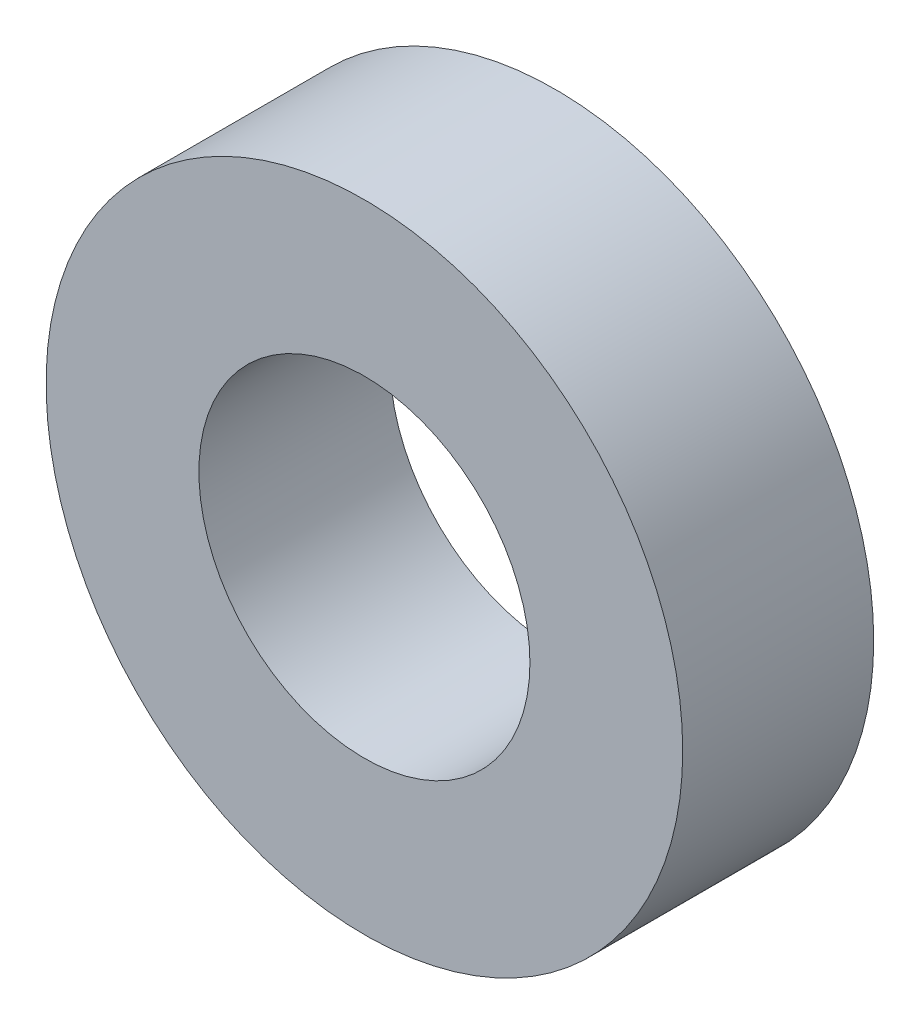
ISO-10303-21;
HEADER;
FILE_DESCRIPTION(('STEP AP214'),'2;1');
FILE_NAME('part.step','',(''),(''),'','','');
FILE_SCHEMA(('AUTOMOTIVE_DESIGN { 1 0 10303 214 1 1 1 1 }'));
ENDSEC;
DATA;
#1=APPLICATION_CONTEXT('core data for automotive mechanical design processes');
#2=APPLICATION_PROTOCOL_DEFINITION('international standard','automotive_design',2000,#1);
#3=PRODUCT_CONTEXT('',#1,'mechanical');
#4=PRODUCT('Part','Part','',(#3));
#5=PRODUCT_RELATED_PRODUCT_CATEGORY('part','',(#4));
#6=PRODUCT_DEFINITION_FORMATION('','',#4);
#7=PRODUCT_DEFINITION_CONTEXT('part definition',#1,'design');
#8=PRODUCT_DEFINITION('design','',#6,#7);
#9=PRODUCT_DEFINITION_SHAPE('','',#8);
#10=(LENGTH_UNIT() NAMED_UNIT(*) SI_UNIT(.MILLI.,.METRE.));
#11=(NAMED_UNIT(*) PLANE_ANGLE_UNIT() SI_UNIT($,.RADIAN.));
#12=(NAMED_UNIT(*) SI_UNIT($,.STERADIAN.) SOLID_ANGLE_UNIT());
#13=UNCERTAINTY_MEASURE_WITH_UNIT(LENGTH_MEASURE(1.E-05),#10,'distance_accuracy_value','');
#14=(GEOMETRIC_REPRESENTATION_CONTEXT(3) GLOBAL_UNCERTAINTY_ASSIGNED_CONTEXT((#13)) GLOBAL_UNIT_ASSIGNED_CONTEXT((#10,
#11,#12)) REPRESENTATION_CONTEXT('',''));
#15=CARTESIAN_POINT('',(0.,0.,0.));
#16=DIRECTION('',(0.,0.,1.));
#17=DIRECTION('',(1.,0.,0.));
#18=AXIS2_PLACEMENT_3D('',#15,#16,#17);
#19=CARTESIAN_POINT('',(0.,0.,3.));
#20=DIRECTION('',(0.,0.,1.));
#21=DIRECTION('',(1.,0.,0.));
#22=AXIS2_PLACEMENT_3D('',#19,#20,#21);
#23=PLANE('',#22);
#24=CARTESIAN_POINT('',(0.,0.,3.));
#25=DIRECTION('',(0.,0.,1.));
#26=DIRECTION('',(1.,0.,0.));
#27=AXIS2_PLACEMENT_3D('',#24,#25,#26);
#28=CIRCLE('',#27,5.);
#29=CARTESIAN_POINT('',(5.,0.,3.));
#30=VERTEX_POINT('',#29);
#31=EDGE_CURVE('E10',#30,#30,#28,.T.);
#32=ORIENTED_EDGE('',*,*,#31,.T.);
#33=EDGE_LOOP('',(#32));
#34=FACE_BOUND('',#33,.T.);
#35=CARTESIAN_POINT('',(0.,0.,3.));
#36=DIRECTION('',(0.,0.,1.));
#37=DIRECTION('',(1.,0.,0.));
#38=AXIS2_PLACEMENT_3D('',#35,#36,#37);
#39=CIRCLE('',#38,2.6);
#40=CARTESIAN_POINT('',(2.6,0.,3.));
#41=VERTEX_POINT('',#40);
#42=EDGE_CURVE('E44',#41,#41,#39,.T.);
#43=ORIENTED_EDGE('',*,*,#42,.F.);
#44=EDGE_LOOP('',(#43));
#45=FACE_BOUND('',#44,.T.);
#46=ADVANCED_FACE('F33',(#34,#45),#23,.T.);
#47=CARTESIAN_POINT('',(0.,0.,0.));
#48=DIRECTION('',(0.,0.,1.));
#49=DIRECTION('',(1.,0.,0.));
#50=AXIS2_PLACEMENT_3D('',#47,#48,#49);
#51=PLANE('',#50);
#52=CARTESIAN_POINT('',(0.,0.,0.));
#53=DIRECTION('',(0.,0.,1.));
#54=DIRECTION('',(1.,0.,0.));
#55=AXIS2_PLACEMENT_3D('',#52,#53,#54);
#56=CIRCLE('',#55,5.);
#57=CARTESIAN_POINT('',(5.,0.,0.));
#58=VERTEX_POINT('',#57);
#59=EDGE_CURVE('E37',#58,#58,#56,.T.);
#60=ORIENTED_EDGE('',*,*,#59,.F.);
#61=EDGE_LOOP('',(#60));
#62=FACE_BOUND('',#61,.T.);
#63=CARTESIAN_POINT('',(0.,0.,0.));
#64=DIRECTION('',(0.,0.,1.));
#65=DIRECTION('',(1.,0.,0.));
#66=AXIS2_PLACEMENT_3D('',#63,#64,#65);
#67=CIRCLE('',#66,2.6);
#68=CARTESIAN_POINT('',(2.6,0.,0.));
#69=VERTEX_POINT('',#68);
#70=EDGE_CURVE('E46',#69,#69,#67,.T.);
#71=ORIENTED_EDGE('',*,*,#70,.T.);
#72=EDGE_LOOP('',(#71));
#73=FACE_BOUND('',#72,.T.);
#74=ADVANCED_FACE('F56',(#62,#73),#51,.F.);
#75=CARTESIAN_POINT('',(0.,0.,3.));
#76=DIRECTION('',(0.,0.,-1.));
#77=DIRECTION('',(-1.,0.,0.));
#78=AXIS2_PLACEMENT_3D('',#75,#76,#77);
#79=CYLINDRICAL_SURFACE('',#78,5.);
#80=ORIENTED_EDGE('',*,*,#31,.F.);
#81=EDGE_LOOP('',(#80));
#82=FACE_BOUND('',#81,.T.);
#83=ORIENTED_EDGE('',*,*,#59,.T.);
#84=EDGE_LOOP('',(#83));
#85=FACE_BOUND('',#84,.T.);
#86=ADVANCED_FACE('F35',(#82,#85),#79,.T.);
#87=CARTESIAN_POINT('',(0.,0.,3.));
#88=DIRECTION('',(0.,0.,-1.));
#89=DIRECTION('',(-1.,0.,0.));
#90=AXIS2_PLACEMENT_3D('',#87,#88,#89);
#91=CYLINDRICAL_SURFACE('',#90,2.6);
#92=ORIENTED_EDGE('',*,*,#42,.T.);
#93=EDGE_LOOP('',(#92));
#94=FACE_BOUND('',#93,.T.);
#95=ORIENTED_EDGE('',*,*,#70,.F.);
#96=EDGE_LOOP('',(#95));
#97=FACE_BOUND('',#96,.T.);
#98=ADVANCED_FACE('F52',(#94,#97),#91,.F.);
#99=CLOSED_SHELL('',(#46,#74,#86,#98));
#100=MANIFOLD_SOLID_BREP('B2',#99);
#101=ADVANCED_BREP_SHAPE_REPRESENTATION('',(#18,#100),#14);
#102=SHAPE_DEFINITION_REPRESENTATION(#9,#101);
ENDSEC;
END-ISO-10303-21;
